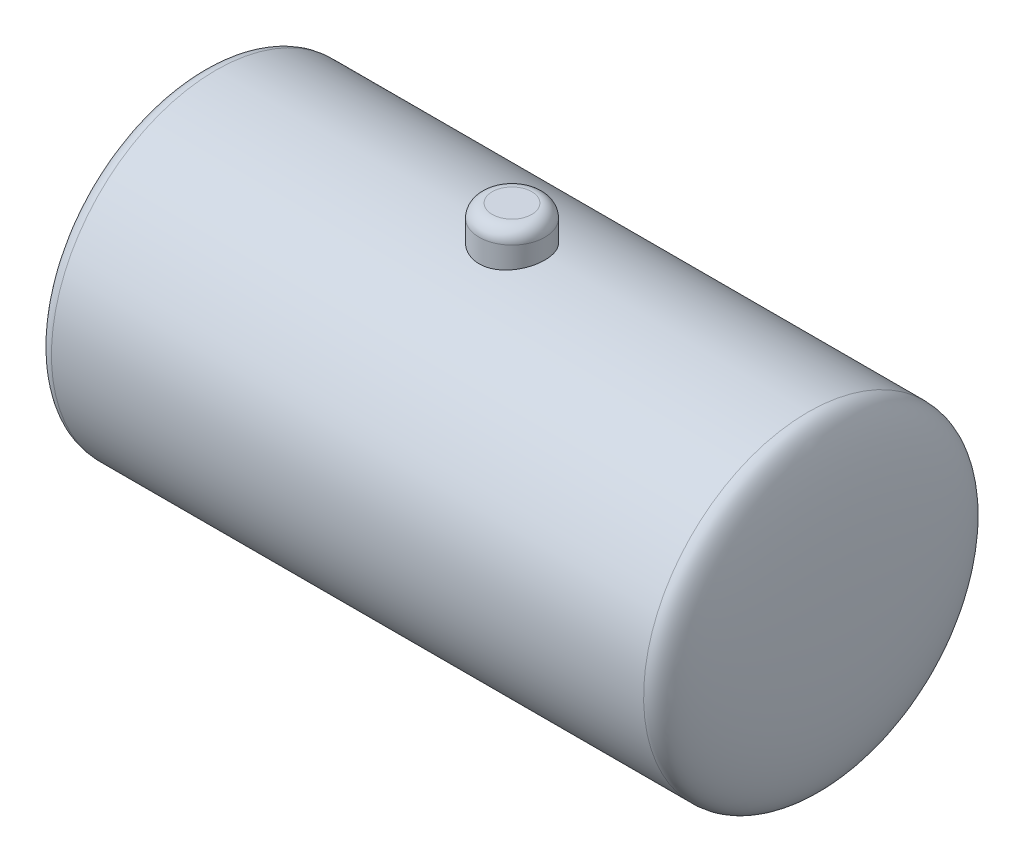
ISO-10303-21;
HEADER;
FILE_DESCRIPTION(('STEP AP214'),'2;1');
FILE_NAME('part.step','',(''),(''),'','','');
FILE_SCHEMA(('AUTOMOTIVE_DESIGN { 1 0 10303 214 1 1 1 1 }'));
ENDSEC;
DATA;
#1=APPLICATION_CONTEXT('core data for automotive mechanical design processes');
#2=APPLICATION_PROTOCOL_DEFINITION('international standard','automotive_design',2000,#1);
#3=PRODUCT_CONTEXT('',#1,'mechanical');
#4=PRODUCT('Part','Part','',(#3));
#5=PRODUCT_RELATED_PRODUCT_CATEGORY('part','',(#4));
#6=PRODUCT_DEFINITION_FORMATION('','',#4);
#7=PRODUCT_DEFINITION_CONTEXT('part definition',#1,'design');
#8=PRODUCT_DEFINITION('design','',#6,#7);
#9=PRODUCT_DEFINITION_SHAPE('','',#8);
#10=(LENGTH_UNIT() NAMED_UNIT(*) SI_UNIT(.MILLI.,.METRE.));
#11=(NAMED_UNIT(*) PLANE_ANGLE_UNIT() SI_UNIT($,.RADIAN.));
#12=(NAMED_UNIT(*) SI_UNIT($,.STERADIAN.) SOLID_ANGLE_UNIT());
#13=UNCERTAINTY_MEASURE_WITH_UNIT(LENGTH_MEASURE(1.E-05),#10,'distance_accuracy_value','');
#14=(GEOMETRIC_REPRESENTATION_CONTEXT(3) GLOBAL_UNCERTAINTY_ASSIGNED_CONTEXT((#13)) GLOBAL_UNIT_ASSIGNED_CONTEXT((#10,
#11,#12)) REPRESENTATION_CONTEXT('',''));
#15=CARTESIAN_POINT('',(0.,0.,0.));
#16=DIRECTION('',(0.,0.,1.));
#17=DIRECTION('',(1.,0.,0.));
#18=AXIS2_PLACEMENT_3D('',#15,#16,#17);
#19=CARTESIAN_POINT('',(45.,0.,0.));
#20=DIRECTION('',(-1.,0.,0.));
#21=DIRECTION('',(0.,0.,1.));
#22=AXIS2_PLACEMENT_3D('',#19,#20,#21);
#23=CYLINDRICAL_SURFACE('',#22,25.);
#24=CARTESIAN_POINT('',(25.,-24.8746859276655,2.5));
#25=CARTESIAN_POINT('',(25.140048910434,-24.8746875699226,2.49999393348378));
#26=CARTESIAN_POINT('',(25.2801904210296,-24.8758814248555,2.48819214745619));
#27=CARTESIAN_POINT('',(25.5565879657338,-24.880527188953,2.4412907869089));
#28=CARTESIAN_POINT('',(25.6928395450937,-24.8839815865305,2.40616553721609));
#29=CARTESIAN_POINT('',(25.9574145480448,-24.8927533261847,2.31365029017232));
#30=CARTESIAN_POINT('',(26.0857427234786,-24.8980695386697,2.25627379073475));
#31=CARTESIAN_POINT('',(26.3309194807294,-24.9099645142955,2.12091066847775));
#32=CARTESIAN_POINT('',(26.4477703362093,-24.9165430266082,2.04292813906481));
#33=CARTESIAN_POINT('',(26.6671281591437,-24.9302481677475,1.86826190499676));
#34=CARTESIAN_POINT('',(26.7695875237595,-24.9373765001317,1.77151854527065));
#35=CARTESIAN_POINT('',(26.9568440225089,-24.951362630893,1.56220428829891));
#36=CARTESIAN_POINT('',(27.0416403485158,-24.9582204168803,1.44963266726642));
#37=CARTESIAN_POINT('',(27.1913281425179,-24.9709095788901,1.21156590412747));
#38=CARTESIAN_POINT('',(27.2561774969842,-24.9767387723662,1.08604415632392));
#39=CARTESIAN_POINT('',(27.3638610828717,-24.9866954218943,0.825824960718775));
#40=CARTESIAN_POINT('',(27.4066958509237,-24.9908229194266,0.691127736670546));
#41=CARTESIAN_POINT('',(27.4689947733831,-24.9968991642756,0.416861956857374));
#42=CARTESIAN_POINT('',(27.4885370818749,-24.9988551960704,0.277311317578954));
#43=CARTESIAN_POINT('',(27.5039381728343,-25.0003928899673,-0.00310185172235723));
#44=CARTESIAN_POINT('',(27.4997975693657,-24.9999746136318,-0.143964347636152));
#45=CARTESIAN_POINT('',(27.4680138183746,-24.9968167827796,-0.422472110161399));
#46=CARTESIAN_POINT('',(27.4404547110903,-24.9940855287928,-0.560127074837447));
#47=CARTESIAN_POINT('',(27.3627471776334,-24.9866182316233,-0.828847948761331));
#48=CARTESIAN_POINT('',(27.3125984580311,-24.9818821623988,-0.95991377239432));
#49=CARTESIAN_POINT('',(27.1910430918639,-24.9709234370979,-1.21200078669896));
#50=CARTESIAN_POINT('',(27.1195992561746,-24.9646981841439,-1.33300392745412));
#51=CARTESIAN_POINT('',(26.9575086916591,-24.9514596129852,-1.56133378293548));
#52=CARTESIAN_POINT('',(26.866861399637,-24.9444462716703,-1.66866009640207));
#53=CARTESIAN_POINT('',(26.6684644262159,-24.9303823366963,-1.86708192955672));
#54=CARTESIAN_POINT('',(26.5606416381461,-24.9233317143257,-1.95810436547586));
#55=CARTESIAN_POINT('',(26.3312078369731,-24.9100184982056,-2.12076883839479));
#56=CARTESIAN_POINT('',(26.2095968038696,-24.9037559055991,-2.19241084728222));
#57=CARTESIAN_POINT('',(25.9559824370005,-24.8927272378537,-2.31428046143307));
#58=CARTESIAN_POINT('',(25.8239769189428,-24.8879614783139,-2.3645035514324));
#59=CARTESIAN_POINT('',(25.5533484884633,-24.8804725467734,-2.44205183909397));
#60=CARTESIAN_POINT('',(25.4147257777814,-24.8777493125442,-2.46937773435758));
#61=CARTESIAN_POINT('',(25.1354395511762,-24.8746645131854,-2.5002619384799));
#62=CARTESIAN_POINT('',(24.9947874493379,-24.8742927886901,-2.50392249161803));
#63=CARTESIAN_POINT('',(24.7148718354428,-24.8759262838693,-2.4876406171784));
#64=CARTESIAN_POINT('',(24.5756083046491,-24.8779314714265,-2.46769850852438));
#65=CARTESIAN_POINT('',(24.3027210443041,-24.88408361056,-2.4048629362688));
#66=CARTESIAN_POINT('',(24.1690860722633,-24.8882260500336,-2.36201781797227));
#67=CARTESIAN_POINT('',(23.9108998706742,-24.8981822759699,-2.25464179918985));
#68=CARTESIAN_POINT('',(23.786348849282,-24.9039961007167,-2.19011040195897));
#69=CARTESIAN_POINT('',(23.5494000649281,-24.9166646088928,-2.04093750355804));
#70=CARTESIAN_POINT('',(23.4370451450844,-24.9235227703668,-1.95622824960173));
#71=CARTESIAN_POINT('',(23.2281123668148,-24.9374958156297,-1.76920133362794));
#72=CARTESIAN_POINT('',(23.1315348991498,-24.9446107057716,-1.66688323562034));
#73=CARTESIAN_POINT('',(22.9565459165048,-24.9583261962325,-1.44709951056618));
#74=CARTESIAN_POINT('',(22.8782011010344,-24.9649248513869,-1.32958063992363));
#75=CARTESIAN_POINT('',(22.742360328734,-24.9768360526658,-1.08299429354283));
#76=CARTESIAN_POINT('',(22.6848640862322,-24.9821486164123,-0.953926976074064));
#77=CARTESIAN_POINT('',(22.5924655808617,-24.9908802603501,-0.688140316082039));
#78=CARTESIAN_POINT('',(22.557523031687,-24.9943027151412,-0.551435094124899));
#79=CARTESIAN_POINT('',(22.5110923260504,-24.9988823653412,-0.274062034959199));
#80=CARTESIAN_POINT('',(22.4996035104149,-25.0000396244141,-0.133394309230545));
#81=CARTESIAN_POINT('',(22.5004156660999,-24.9999584578317,0.147255560189365));
#82=CARTESIAN_POINT('',(22.5126130920916,-24.9987304594167,0.287238018061319));
#83=CARTESIAN_POINT('',(22.5602343641424,-24.9940373394398,0.563154720890906));
#84=CARTESIAN_POINT('',(22.5956582284324,-24.9905722161218,0.699088962670913));
#85=CARTESIAN_POINT('',(22.6886981434823,-24.981793095349,0.963049771919358));
#86=CARTESIAN_POINT('',(22.7463111673354,-24.9764793500812,1.09107741519382));
#87=CARTESIAN_POINT('',(22.8820829222924,-24.9645953104074,1.33566150038699));
#88=CARTESIAN_POINT('',(22.9602415331778,-24.9580250233539,1.4522180094214));
#89=CARTESIAN_POINT('',(23.1352740475594,-24.9443296167264,1.67108181106734));
#90=CARTESIAN_POINT('',(23.232225040612,-24.9372022865175,1.77332731554835));
#91=CARTESIAN_POINT('',(23.4419383788636,-24.9232147692415,1.96014439848285));
#92=CARTESIAN_POINT('',(23.5547045129227,-24.9163546466944,2.04471172961962));
#93=CARTESIAN_POINT('',(23.7931608547998,-24.903659585265,2.19394160106013));
#94=CARTESIAN_POINT('',(23.9188832033101,-24.8978272981327,2.25855296998708));
#95=CARTESIAN_POINT('',(24.1793707281156,-24.8878798690615,2.36566177024692));
#96=CARTESIAN_POINT('',(24.3141255098143,-24.883762791334,2.40818414472464));
#97=CARTESIAN_POINT('',(24.5413693522478,-24.8787501884536,2.45930422083382));
#98=CARTESIAN_POINT('',(24.6324056282661,-24.8772332983924,2.47454428099556));
#99=CARTESIAN_POINT('',(24.8156145576064,-24.8752006294416,2.49489414651278));
#100=CARTESIAN_POINT('',(24.9077872061565,-24.8746848463496,2.50000399439316));
#101=CARTESIAN_POINT('',(25.,-24.8746859276655,2.5));
#102=B_SPLINE_CURVE_WITH_KNOTS('',3,(#24,#25,#26,#27,#28,#29,#30,#31,#32,#33,#34,#35,#36,#37,
#38,#39,#40,#41,#42,#43,#44,#45,#46,#47,#48,#49,#50,#51,#52,#53,#54,#55,#56,#57,#58,#59,#60,#61,
#62,#63,#64,#65,#66,#67,#68,#69,#70,#71,#72,#73,#74,#75,#76,#77,#78,#79,#80,#81,#82,#83,#84,#85,
#86,#87,#88,#89,#90,#91,#92,#93,#94,#95,#96,#97,#98,#99,#100,#101),.UNSPECIFIED.,.T.,.F.,(4,2,2,
2,2,2,2,2,2,2,2,2,2,2,2,2,2,2,2,2,2,2,2,2,2,2,2,2,2,2,2,2,2,2,2,2,2,2,4),(0.,0.419809986091155,
0.840082879554424,1.26010122749368,1.68003620105329,2.10132903824813,2.52264114638132,
2.94483674928229,3.36702206019486,3.78778677246124,4.2085405749558,4.62779079546653,
5.04704646202435,5.46703863666033,5.88704313046321,6.30888562712502,6.73072873568906,
7.15266072794833,7.57457986487581,7.99467490769412,8.41476427417175,8.83397036761317,
9.25318606402618,9.67382974529294,10.0944838430801,10.516653420453,10.9388172129501,
11.360224817359,11.7816205778287,12.2011783367121,12.6207364249164,13.0402372998811,
13.45973572027,13.8809928759497,14.3023511258631,14.7247810267619,15.14673287235,
15.4231506901512,15.6995673475954),.UNSPECIFIED.);
#103=CARTESIAN_POINT('',(25.,-24.8746859276655,2.5));
#104=VERTEX_POINT('',#103);
#105=EDGE_CURVE('E112',#104,#104,#102,.T.);
#106=ORIENTED_EDGE('',*,*,#105,.T.);
#107=EDGE_LOOP('',(#106));
#108=FACE_BOUND('',#107,.T.);
#109=CARTESIAN_POINT('',(-25.,-24.8746859276655,2.5));
#110=CARTESIAN_POINT('',(-24.859951089566,-24.8746875699226,2.49999393348378));
#111=CARTESIAN_POINT('',(-24.7198095789704,-24.8758814248555,2.48819214745619));
#112=CARTESIAN_POINT('',(-24.4434120342662,-24.880527188953,2.4412907869089));
#113=CARTESIAN_POINT('',(-24.3071604549063,-24.8839815865305,2.40616553721609));
#114=CARTESIAN_POINT('',(-24.0425854519552,-24.8927533261847,2.31365029017231));
#115=CARTESIAN_POINT('',(-23.9142572765214,-24.8980695386697,2.25627379073475));
#116=CARTESIAN_POINT('',(-23.6690805192706,-24.9099645142955,2.12091066847775));
#117=CARTESIAN_POINT('',(-23.5522296637907,-24.9165430266082,2.04292813906481));
#118=CARTESIAN_POINT('',(-23.3328718408563,-24.9302481677475,1.86826190499676));
#119=CARTESIAN_POINT('',(-23.2304124762406,-24.9373765001317,1.77151854527065));
#120=CARTESIAN_POINT('',(-23.0431559774911,-24.951362630893,1.56220428829891));
#121=CARTESIAN_POINT('',(-22.9583596514842,-24.9582204168803,1.44963266726642));
#122=CARTESIAN_POINT('',(-22.8086718574821,-24.9709095788901,1.21156590412747));
#123=CARTESIAN_POINT('',(-22.7438225030158,-24.9767387723662,1.08604415632392));
#124=CARTESIAN_POINT('',(-22.6361389171283,-24.9866954218943,0.825824960718775));
#125=CARTESIAN_POINT('',(-22.5933041490763,-24.9908229194266,0.691127736670546));
#126=CARTESIAN_POINT('',(-22.5310052266169,-24.9968991642756,0.416861956857374));
#127=CARTESIAN_POINT('',(-22.5114629181251,-24.9988551960704,0.277311317578954));
#128=CARTESIAN_POINT('',(-22.4960618271657,-25.0003928899673,-0.00310185172235731));
#129=CARTESIAN_POINT('',(-22.5002024306343,-24.9999746136318,-0.143964347636153));
#130=CARTESIAN_POINT('',(-22.5319861816254,-24.9968167827796,-0.422472110161399));
#131=CARTESIAN_POINT('',(-22.5595452889097,-24.9940855287928,-0.560127074837446));
#132=CARTESIAN_POINT('',(-22.6372528223666,-24.9866182316233,-0.828847948761331));
#133=CARTESIAN_POINT('',(-22.6874015419689,-24.9818821623988,-0.95991377239432));
#134=CARTESIAN_POINT('',(-22.8089569081361,-24.9709234370979,-1.21200078669896));
#135=CARTESIAN_POINT('',(-22.8804007438254,-24.9646981841439,-1.33300392745412));
#136=CARTESIAN_POINT('',(-23.0424913083409,-24.9514596129852,-1.56133378293548));
#137=CARTESIAN_POINT('',(-23.133138600363,-24.9444462716703,-1.66866009640207));
#138=CARTESIAN_POINT('',(-23.3315355737841,-24.9303823366963,-1.86708192955672));
#139=CARTESIAN_POINT('',(-23.4393583618539,-24.9233317143257,-1.95810436547585));
#140=CARTESIAN_POINT('',(-23.6687921630269,-24.9100184982056,-2.12076883839479));
#141=CARTESIAN_POINT('',(-23.7904031961304,-24.9037559055991,-2.19241084728222));
#142=CARTESIAN_POINT('',(-24.0440175629995,-24.8927272378537,-2.31428046143307));
#143=CARTESIAN_POINT('',(-24.1760230810572,-24.8879614783139,-2.3645035514324));
#144=CARTESIAN_POINT('',(-24.4466515115367,-24.8804725467734,-2.44205183909397));
#145=CARTESIAN_POINT('',(-24.5852742222186,-24.8777493125442,-2.46937773435758));
#146=CARTESIAN_POINT('',(-24.8645604488238,-24.8746645131854,-2.5002619384799));
#147=CARTESIAN_POINT('',(-25.0052125506621,-24.8742927886901,-2.50392249161803));
#148=CARTESIAN_POINT('',(-25.2851281645572,-24.8759262838693,-2.4876406171784));
#149=CARTESIAN_POINT('',(-25.4243916953509,-24.8779314714265,-2.46769850852438));
#150=CARTESIAN_POINT('',(-25.6972789556959,-24.88408361056,-2.4048629362688));
#151=CARTESIAN_POINT('',(-25.8309139277367,-24.8882260500336,-2.36201781797227));
#152=CARTESIAN_POINT('',(-26.0891001293258,-24.8981822759699,-2.25464179918985));
#153=CARTESIAN_POINT('',(-26.213651150718,-24.9039961007167,-2.19011040195897));
#154=CARTESIAN_POINT('',(-26.4505999350719,-24.9166646088928,-2.04093750355804));
#155=CARTESIAN_POINT('',(-26.5629548549156,-24.9235227703668,-1.95622824960173));
#156=CARTESIAN_POINT('',(-26.7718876331852,-24.9374958156297,-1.76920133362793));
#157=CARTESIAN_POINT('',(-26.8684651008502,-24.9446107057716,-1.66688323562034));
#158=CARTESIAN_POINT('',(-27.0434540834952,-24.9583261962325,-1.44709951056618));
#159=CARTESIAN_POINT('',(-27.1217988989656,-24.9649248513869,-1.32958063992363));
#160=CARTESIAN_POINT('',(-27.257639671266,-24.9768360526658,-1.08299429354283));
#161=CARTESIAN_POINT('',(-27.3151359137678,-24.9821486164123,-0.953926976074064));
#162=CARTESIAN_POINT('',(-27.4075344191383,-24.9908802603501,-0.688140316082038));
#163=CARTESIAN_POINT('',(-27.442476968313,-24.9943027151412,-0.551435094124899));
#164=CARTESIAN_POINT('',(-27.4889076739496,-24.9988823653412,-0.274062034959199));
#165=CARTESIAN_POINT('',(-27.5003964895851,-25.0000396244141,-0.133394309230545));
#166=CARTESIAN_POINT('',(-27.4995843339002,-24.9999584578317,0.147255560189365));
#167=CARTESIAN_POINT('',(-27.4873869079084,-24.9987304594167,0.287238018061319));
#168=CARTESIAN_POINT('',(-27.4397656358576,-24.9940373394398,0.563154720890906));
#169=CARTESIAN_POINT('',(-27.4043417715676,-24.9905722161218,0.699088962670912));
#170=CARTESIAN_POINT('',(-27.3113018565177,-24.981793095349,0.963049771919356));
#171=CARTESIAN_POINT('',(-27.2536888326646,-24.9764793500812,1.09107741519382));
#172=CARTESIAN_POINT('',(-27.1179170777076,-24.9645953104074,1.33566150038699));
#173=CARTESIAN_POINT('',(-27.0397584668222,-24.9580250233539,1.4522180094214));
#174=CARTESIAN_POINT('',(-26.8647259524406,-24.9443296167264,1.67108181106734));
#175=CARTESIAN_POINT('',(-26.767774959388,-24.9372022865175,1.77332731554835));
#176=CARTESIAN_POINT('',(-26.5580616211364,-24.9232147692415,1.96014439848285));
#177=CARTESIAN_POINT('',(-26.4452954870773,-24.9163546466944,2.04471172961962));
#178=CARTESIAN_POINT('',(-26.2068391452002,-24.903659585265,2.19394160106013));
#179=CARTESIAN_POINT('',(-26.0811167966899,-24.8978272981327,2.25855296998708));
#180=CARTESIAN_POINT('',(-25.8206292718844,-24.8878798690615,2.36566177024692));
#181=CARTESIAN_POINT('',(-25.6858744901857,-24.883762791334,2.40818414472464));
#182=CARTESIAN_POINT('',(-25.4586306477522,-24.8787501884536,2.45930422083382));
#183=CARTESIAN_POINT('',(-25.3675943717339,-24.8772332983924,2.47454428099556));
#184=CARTESIAN_POINT('',(-25.1843854423936,-24.8752006294416,2.49489414651278));
#185=CARTESIAN_POINT('',(-25.0922127938435,-24.8746848463496,2.50000399439316));
#186=CARTESIAN_POINT('',(-25.,-24.8746859276655,2.5));
#187=B_SPLINE_CURVE_WITH_KNOTS('',3,(#109,#110,#111,#112,#113,#114,#115,#116,#117,#118,#119,
#120,#121,#122,#123,#124,#125,#126,#127,#128,#129,#130,#131,#132,#133,#134,#135,#136,#137,#138,
#139,#140,#141,#142,#143,#144,#145,#146,#147,#148,#149,#150,#151,#152,#153,#154,#155,#156,#157,
#158,#159,#160,#161,#162,#163,#164,#165,#166,#167,#168,#169,#170,#171,#172,#173,#174,#175,#176,
#177,#178,#179,#180,#181,#182,#183,#184,#185,#186),.UNSPECIFIED.,.T.,.F.,(4,2,2,2,2,2,2,2,2,2,2,
2,2,2,2,2,2,2,2,2,2,2,2,2,2,2,2,2,2,2,2,2,2,2,2,2,2,2,4),(0.,0.419809986091155,
0.840082879554424,1.26010122749368,1.68003620105329,2.10132903824813,2.52264114638132,
2.94483674928229,3.36702206019486,3.78778677246124,4.2085405749558,4.62779079546653,
5.04704646202435,5.46703863666033,5.88704313046321,6.30888562712502,6.73072873568907,
7.15266072794833,7.57457986487581,7.99467490769413,8.41476427417175,8.83397036761317,
9.25318606402618,9.67382974529294,10.0944838430801,10.5166534204529,10.9388172129501,
11.360224817359,11.7816205778287,12.2011783367121,12.6207364249164,13.0402372998811,
13.45973572027,13.8809928759497,14.3023511258631,14.7247810267619,15.14673287235,
15.4231506901512,15.6995673475954),.UNSPECIFIED.);
#188=CARTESIAN_POINT('',(-25.,-24.8746859276655,2.5));
#189=VERTEX_POINT('',#188);
#190=EDGE_CURVE('E65',#189,#189,#187,.T.);
#191=ORIENTED_EDGE('',*,*,#190,.T.);
#192=EDGE_LOOP('',(#191));
#193=FACE_BOUND('',#192,.T.);
#194=CARTESIAN_POINT('',(45.,0.,0.));
#195=DIRECTION('',(1.,0.,0.));
#196=DIRECTION('',(0.,0.,-1.));
#197=AXIS2_PLACEMENT_3D('',#194,#195,#196);
#198=CIRCLE('',#197,25.);
#199=CARTESIAN_POINT('',(45.,0.,-25.));
#200=VERTEX_POINT('',#199);
#201=EDGE_CURVE('E56',#200,#200,#198,.T.);
#202=ORIENTED_EDGE('',*,*,#201,.F.);
#203=EDGE_LOOP('',(#202));
#204=FACE_BOUND('',#203,.T.);
#205=CARTESIAN_POINT('',(-45.,0.,0.));
#206=DIRECTION('',(1.,0.,0.));
#207=DIRECTION('',(0.,1.,0.));
#208=AXIS2_PLACEMENT_3D('',#205,#206,#207);
#209=CIRCLE('',#208,25.);
#210=CARTESIAN_POINT('',(-45.,25.,0.));
#211=VERTEX_POINT('',#210);
#212=EDGE_CURVE('E59',#211,#211,#209,.T.);
#213=ORIENTED_EDGE('',*,*,#212,.T.);
#214=EDGE_LOOP('',(#213));
#215=FACE_BOUND('',#214,.T.);
#216=CARTESIAN_POINT('',(0.,24.4948974278318,-5.));
#217=CARTESIAN_POINT('',(-0.138956228432175,24.4948959140652,-5.00000277932283));
#218=CARTESIAN_POINT('',(-0.277877759427022,24.4960820445244,-4.99420583952395));
#219=CARTESIAN_POINT('',(-0.554760910782418,24.5007881327193,-4.97106951247274));
#220=CARTESIAN_POINT('',(-0.692722344806998,24.5043085313918,-4.95372794446977));
#221=CARTESIAN_POINT('',(-0.966714129081263,24.5135833999899,-4.90762442723258));
#222=CARTESIAN_POINT('',(-1.10274345492746,24.5193390123237,-4.8788566379347));
#223=CARTESIAN_POINT('',(-1.37188892080659,24.5329168521693,-4.8101161975473));
#224=CARTESIAN_POINT('',(-1.50500396886891,24.5407398404405,-4.77013942141009));
#225=CARTESIAN_POINT('',(-1.76715614052518,24.5582115919251,-4.679356239882));
#226=CARTESIAN_POINT('',(-1.89619864039771,24.5678578195523,-4.62856486213672));
#227=CARTESIAN_POINT('',(-2.14956304127907,24.5887102826167,-4.51647818958425));
#228=CARTESIAN_POINT('',(-2.27388318016664,24.5999170932378,-4.45517901998884));
#229=CARTESIAN_POINT('',(-2.5168633390302,24.6235656382957,-4.32256259117468));
#230=CARTESIAN_POINT('',(-2.63552584385088,24.6360068230559,-4.25124978528394));
#231=CARTESIAN_POINT('',(-2.86650780331227,24.6617859698465,-4.09905714012307));
#232=CARTESIAN_POINT('',(-2.97882486626249,24.6751242659164,-4.0181737286281));
#233=CARTESIAN_POINT('',(-3.19767262714864,24.7024933301151,-3.84635941756609));
#234=CARTESIAN_POINT('',(-3.30411496524357,24.7165306060046,-3.7553169869603));
#235=CARTESIAN_POINT('',(-3.50901761116524,24.7447550172108,-3.56460271884441));
#236=CARTESIAN_POINT('',(-3.60747494602792,24.7589422061409,-3.46492769556318));
#237=CARTESIAN_POINT('',(-3.79566965444345,24.7870621737417,-3.25767968751707));
#238=CARTESIAN_POINT('',(-3.88540959714398,24.80099502638,-3.15010904621878));
#239=CARTESIAN_POINT('',(-4.05561553244616,24.8282290266689,-2.92772937682517));
#240=CARTESIAN_POINT('',(-4.13607809534406,24.8415299396397,-2.81291769594009));
#241=CARTESIAN_POINT('',(-4.28775992933208,24.867232331661,-2.57586269555549));
#242=CARTESIAN_POINT('',(-4.35889618572743,24.8796253494226,-2.45356521066842));
#243=CARTESIAN_POINT('',(-4.49061561976306,24.9030409030999,-2.20327286170085));
#244=CARTESIAN_POINT('',(-4.55119483884866,24.9140629244939,-2.0752758829805));
#245=CARTESIAN_POINT('',(-4.71629352646733,24.9445697433125,-1.68417147036292));
#246=CARTESIAN_POINT('',(-4.80435684781525,24.9615274484324,-1.41366454176391));
#247=CARTESIAN_POINT('',(-4.9325572950363,24.9865205281948,-0.865044260538021));
#248=CARTESIAN_POINT('',(-4.97331059941089,24.9946705178815,-0.58707808925146));
#249=CARTESIAN_POINT('',(-5.00774904818614,25.001544855821,-0.0281034479881242));
#250=CARTESIAN_POINT('',(-5.00143872813593,25.0002701123409,0.25290472622284));
#251=CARTESIAN_POINT('',(-4.94237059736807,24.9885220591615,0.805712786453444));
#252=CARTESIAN_POINT('',(-4.89027551576091,24.9781800029126,1.07758681729645));
#253=CARTESIAN_POINT('',(-4.74217443608932,24.9496087733464,1.60865738706756));
#254=CARTESIAN_POINT('',(-4.64616668110936,24.93137928446,1.86785341829837));
#255=CARTESIAN_POINT('',(-4.41234990787511,24.8888648238832,2.36809751770485));
#256=CARTESIAN_POINT('',(-4.2742812735962,24.8645424148967,2.60902092474939));
#257=CARTESIAN_POINT('',(-3.96045458469301,24.812523467553,3.06452517521266));
#258=CARTESIAN_POINT('',(-3.7846921932812,24.7848265411053,3.27910298301492));
#259=CARTESIAN_POINT('',(-3.39683189746096,24.7285482199077,3.67975717013202));
#260=CARTESIAN_POINT('',(-3.18415406849625,24.6999598233212,3.86527158685728));
#261=CARTESIAN_POINT('',(-2.730417785602,24.6455785794926,4.19809246189484));
#262=CARTESIAN_POINT('',(-2.48935879501062,24.6197857851305,4.3453981975471));
#263=CARTESIAN_POINT('',(-1.98489584146561,24.5739023737433,4.5978140751034));
#264=CARTESIAN_POINT('',(-1.72144516194926,24.5538240781191,4.7028332392629));
#265=CARTESIAN_POINT('',(-1.1801433812325,24.521823816122,4.86695170776361));
#266=CARTESIAN_POINT('',(-0.902294161888907,24.5099007867518,4.9260569968798));
#267=CARTESIAN_POINT('',(-0.345175710012984,24.4957739630664,4.99583003057767));
#268=CARTESIAN_POINT('',(-0.0660121283522963,24.493407351626,5.00730929570102));
#269=CARTESIAN_POINT('',(0.490241115924468,24.4982242831088,4.98368814034094));
#270=CARTESIAN_POINT('',(0.767330895246229,24.5054072844901,4.94859036116145));
#271=CARTESIAN_POINT('',(1.30884320179901,24.5283616252697,4.83351104478034));
#272=CARTESIAN_POINT('',(1.57336171646508,24.5440499515026,4.75396312055877));
#273=CARTESIAN_POINT('',(2.08531639385734,24.5821744668054,4.55270516017897));
#274=CARTESIAN_POINT('',(2.33275114737079,24.6046112117261,4.43099165081897));
#275=CARTESIAN_POINT('',(2.80706555462128,24.6540703007231,4.1470207729206));
#276=CARTESIAN_POINT('',(3.03363524979288,24.6811486029996,3.98425562210339));
#277=CARTESIAN_POINT('',(3.45654154171395,24.7366861815763,3.62347762885003));
#278=CARTESIAN_POINT('',(3.65287502295147,24.7651455997886,3.4254611586761));
#279=CARTESIAN_POINT('',(4.01281286527109,24.8207673304219,2.99616224784609));
#280=CARTESIAN_POINT('',(4.17586853389528,24.8479030243562,2.76441580370579));
#281=CARTESIAN_POINT('',(4.46072914686357,24.8973562425148,2.27633617425512));
#282=CARTESIAN_POINT('',(4.5825358235458,24.9196739690654,2.02000402205358));
#283=CARTESIAN_POINT('',(4.78064532630623,24.9568652187611,1.49152568807435));
#284=CARTESIAN_POINT('',(4.85720619263723,24.9717808767,1.21947909079514));
#285=CARTESIAN_POINT('',(4.96345263724712,24.9926598775445,0.665901555502931));
#286=CARTESIAN_POINT('',(4.99314386129754,24.9986242986841,0.384371763979329));
#287=CARTESIAN_POINT('',(5.00180038909471,25.0003623098663,-0.0359308696076334));
#288=CARTESIAN_POINT('',(4.99887564200989,24.9997743264358,-0.174547706902776));
#289=CARTESIAN_POINT('',(4.98153854083119,24.9963121932555,-0.451018250343529));
#290=CARTESIAN_POINT('',(4.96713054343888,24.9934389105404,-0.588872225946722));
#291=CARTESIAN_POINT('',(4.92692863683965,24.9854807163608,-0.8628829006169));
#292=CARTESIAN_POINT('',(4.90113078415607,24.9803950389143,-0.999038995028385));
#293=CARTESIAN_POINT('',(4.83836516551053,24.9681563049873,-1.2686070645044));
#294=CARTESIAN_POINT('',(4.8014013926633,24.9610039876105,-1.40202000237942));
#295=CARTESIAN_POINT('',(4.71666615796401,24.9448434641995,-1.66496388536662));
#296=CARTESIAN_POINT('',(4.66891578522037,24.9358388825964,-1.79450185423182));
#297=CARTESIAN_POINT('',(4.56294207731695,24.9162142305196,-2.04903823379663));
#298=CARTESIAN_POINT('',(4.50472245389937,24.9055947327996,-2.17403823455953));
#299=CARTESIAN_POINT('',(4.37819338299605,24.8830203693368,-2.4187611555957));
#300=CARTESIAN_POINT('',(4.3098797873512,24.8710649550885,-2.53848187993982));
#301=CARTESIAN_POINT('',(4.16368560734574,24.8461484673941,-2.77176194719751));
#302=CARTESIAN_POINT('',(4.08580831288378,24.8331877403362,-2.88532338962303));
#303=CARTESIAN_POINT('',(3.91963723250234,24.8063847462598,-3.107409439357));
#304=CARTESIAN_POINT('',(3.83119274567195,24.7925314606031,-3.21581998719232));
#305=CARTESIAN_POINT('',(3.64558859737661,24.7645291791264,-3.42479299282091));
#306=CARTESIAN_POINT('',(3.5484320083593,24.7503802888953,-3.52535819417319));
#307=CARTESIAN_POINT('',(3.34597252660902,24.7221657734697,-3.71806545178663));
#308=CARTESIAN_POINT('',(3.24066479635567,24.7081002031371,-3.81020243422066));
#309=CARTESIAN_POINT('',(3.02270103815523,24.6804587105912,-3.98532502872243));
#310=CARTESIAN_POINT('',(2.91004772292782,24.6668826104611,-4.06831398902585));
#311=CARTESIAN_POINT('',(2.6768148430827,24.6404498236186,-4.22547700693866));
#312=CARTESIAN_POINT('',(2.55616077080287,24.6276028717508,-4.29954219421514));
#313=CARTESIAN_POINT('',(2.30895553115726,24.6031736469171,-4.43719880973621));
#314=CARTESIAN_POINT('',(2.18240655122683,24.5915909100867,-4.50079408397347));
#315=CARTESIAN_POINT('',(1.92432888446366,24.5700331062172,-4.61703044134767));
#316=CARTESIAN_POINT('',(1.79280329372797,24.5600570592754,-4.66967820699909));
#317=CARTESIAN_POINT('',(1.52568600190167,24.5420037041339,-4.76364722951765));
#318=CARTESIAN_POINT('',(1.39009509313648,24.5339260286217,-4.80497067776392));
#319=CARTESIAN_POINT('',(1.04878231160884,24.516494143671,-4.89330917087387));
#320=CARTESIAN_POINT('',(0.841122048542001,24.5084401426211,-4.93326336835889));
#321=CARTESIAN_POINT('',(0.422281082826919,24.4976430260943,-4.98660621384694));
#322=CARTESIAN_POINT('',(0.211100501797822,24.4948997275263,-4.99999577768877));
#323=CARTESIAN_POINT('',(0.,24.4948974278318,-5.));
#324=B_SPLINE_CURVE_WITH_KNOTS('',3,(#216,#217,#218,#219,#220,#221,#222,#223,#224,#225,#226,
#227,#228,#229,#230,#231,#232,#233,#234,#235,#236,#237,#238,#239,#240,#241,#242,#243,#244,#245,
#246,#247,#248,#249,#250,#251,#252,#253,#254,#255,#256,#257,#258,#259,#260,#261,#262,#263,#264,
#265,#266,#267,#268,#269,#270,#271,#272,#273,#274,#275,#276,#277,#278,#279,#280,#281,#282,#283,
#284,#285,#286,#287,#288,#289,#290,#291,#292,#293,#294,#295,#296,#297,#298,#299,#300,#301,#302,
#303,#304,#305,#306,#307,#308,#309,#310,#311,#312,#313,#314,#315,#316,#317,#318,#319,#320,#321,
#322,#323),.UNSPECIFIED.,.T.,.F.,(4,2,2,2,2,2,2,2,2,2,2,2,2,2,2,2,2,2,2,2,2,2,2,2,2,2,2,2,2,2,2,
2,2,2,2,2,2,2,2,2,2,2,2,2,2,2,2,2,2,2,2,2,2,4),(0.,0.416683123532558,0.833444979779736,
1.25042012213458,1.66754891843381,2.08410182437339,2.50080866752238,2.91733077366025,
3.33400883985332,3.75582155231457,4.17779059926178,4.59963490581337,5.02163466502476,
5.44716701587087,5.87285858614629,6.72323197660176,7.56240100842779,8.40148917008619,
9.22862804595065,10.0558000179613,10.8881847753889,11.7206653527771,12.5676559023979,
13.4146624704098,14.2634817229126,15.112190315075,15.9463764545252,16.780515290738,
17.6066556534829,18.4328640820369,19.269841553043,20.1069052078274,20.9568186509895,
21.8066963958222,22.6516792432494,23.4965602988983,23.9121012971265,24.3274847156826,
24.7430120641575,25.158390988859,25.5729647204247,25.9873917587991,26.4019895837877,
26.8164451851411,27.2377409358741,27.6588886906077,28.0802883323103,28.5015332232677,
28.9274855291216,29.3532810158644,29.7788158230356,30.2042682263315,30.8373096537297,
31.4703292560956),.UNSPECIFIED.);
#325=CARTESIAN_POINT('',(0.,24.4948974278318,-5.));
#326=VERTEX_POINT('',#325);
#327=EDGE_CURVE('E58',#326,#326,#324,.T.);
#328=ORIENTED_EDGE('',*,*,#327,.F.);
#329=EDGE_LOOP('',(#328));
#330=FACE_BOUND('',#329,.T.);
#331=ADVANCED_FACE('F34',(#108,#193,#204,#215,#330),#23,.T.);
#332=CARTESIAN_POINT('',(-45.,25.,0.));
#333=CARTESIAN_POINT('',(-50.,25.,0.));
#334=CARTESIAN_POINT('',(-50.,0.,0.));
#335=B_SPLINE_CURVE_WITH_KNOTS('',2,(#332,#333,#334),.UNSPECIFIED.,.F.,.F.,(3,3),(0.,1.),.UNSPECIFIED.);
#336=CARTESIAN_POINT('',(-45.,0.,0.));
#337=DIRECTION('',(1.,0.,0.));
#338=AXIS1_PLACEMENT('',#336,#337);
#339=SURFACE_OF_REVOLUTION('',#335,#338);
#340=CARTESIAN_POINT('',(-50.,0.,0.));
#341=VERTEX_POINT('',#340);
#342=VERTEX_LOOP('',#341);
#343=FACE_BOUND('',#342,.T.);
#344=ORIENTED_EDGE('',*,*,#212,.F.);
#345=EDGE_LOOP('',(#344));
#346=FACE_BOUND('',#345,.T.);
#347=ADVANCED_FACE('F52',(#343,#346),#339,.F.);
#348=CARTESIAN_POINT('',(45.,25.,0.));
#349=CARTESIAN_POINT('',(50.,25.,0.));
#350=CARTESIAN_POINT('',(50.,0.,0.));
#351=B_SPLINE_CURVE_WITH_KNOTS('',2,(#348,#349,#350),.UNSPECIFIED.,.F.,.F.,(3,3),(0.,1.),.UNSPECIFIED.);
#352=CARTESIAN_POINT('',(45.,0.,0.));
#353=DIRECTION('',(-1.,0.,0.));
#354=AXIS1_PLACEMENT('',#352,#353);
#355=SURFACE_OF_REVOLUTION('',#351,#354);
#356=CARTESIAN_POINT('',(50.,0.,0.));
#357=VERTEX_POINT('',#356);
#358=VERTEX_LOOP('',#357);
#359=FACE_BOUND('',#358,.T.);
#360=ORIENTED_EDGE('',*,*,#201,.T.);
#361=EDGE_LOOP('',(#360));
#362=FACE_BOUND('',#361,.T.);
#363=ADVANCED_FACE('F48',(#359,#362),#355,.F.);
#364=CARTESIAN_POINT('',(0.,30.,0.));
#365=DIRECTION('',(0.,-1.,0.));
#366=DIRECTION('',(0.,0.,-1.));
#367=AXIS2_PLACEMENT_3D('',#364,#365,#366);
#368=CYLINDRICAL_SURFACE('',#367,5.);
#369=CARTESIAN_POINT('',(0.,28.,0.));
#370=DIRECTION('',(0.,1.,0.));
#371=DIRECTION('',(0.,0.,1.));
#372=AXIS2_PLACEMENT_3D('',#369,#370,#371);
#373=CIRCLE('',#372,5.);
#374=CARTESIAN_POINT('',(0.,28.,5.));
#375=VERTEX_POINT('',#374);
#376=EDGE_CURVE('E120',#375,#375,#373,.F.);
#377=ORIENTED_EDGE('',*,*,#376,.T.);
#378=EDGE_LOOP('',(#377));
#379=FACE_BOUND('',#378,.T.);
#380=ORIENTED_EDGE('',*,*,#327,.T.);
#381=EDGE_LOOP('',(#380));
#382=FACE_BOUND('',#381,.T.);
#383=ADVANCED_FACE('F51',(#379,#382),#368,.T.);
#384=CARTESIAN_POINT('',(0.,30.,0.));
#385=DIRECTION('',(0.,1.,0.));
#386=DIRECTION('',(0.,0.,1.));
#387=AXIS2_PLACEMENT_3D('',#384,#385,#386);
#388=PLANE('',#387);
#389=CARTESIAN_POINT('',(0.,30.,0.));
#390=DIRECTION('',(0.,1.,0.));
#391=DIRECTION('',(0.,0.,1.));
#392=AXIS2_PLACEMENT_3D('',#389,#390,#391);
#393=CIRCLE('',#392,3.);
#394=CARTESIAN_POINT('',(0.,30.,3.));
#395=VERTEX_POINT('',#394);
#396=EDGE_CURVE('E62',#395,#395,#393,.T.);
#397=ORIENTED_EDGE('',*,*,#396,.T.);
#398=EDGE_LOOP('',(#397));
#399=FACE_BOUND('',#398,.T.);
#400=ADVANCED_FACE('F80',(#399),#388,.T.);
#401=CARTESIAN_POINT('',(0.,28.,0.));
#402=DIRECTION('',(0.,1.,0.));
#403=DIRECTION('',(0.,0.,1.));
#404=AXIS2_PLACEMENT_3D('',#401,#402,#403);
#405=TOROIDAL_SURFACE('',#404,3.,2.);
#406=ORIENTED_EDGE('',*,*,#376,.F.);
#407=EDGE_LOOP('',(#406));
#408=FACE_BOUND('',#407,.T.);
#409=ORIENTED_EDGE('',*,*,#396,.F.);
#410=EDGE_LOOP('',(#409));
#411=FACE_BOUND('',#410,.T.);
#412=ADVANCED_FACE('F130',(#408,#411),#405,.T.);
#413=CARTESIAN_POINT('',(-25.,-30.,0.));
#414=DIRECTION('',(0.,1.,0.));
#415=DIRECTION('',(0.,0.,1.));
#416=AXIS2_PLACEMENT_3D('',#413,#414,#415);
#417=CYLINDRICAL_SURFACE('',#416,2.5);
#418=CARTESIAN_POINT('',(-25.,-29.,0.));
#419=DIRECTION('',(0.,1.,0.));
#420=DIRECTION('',(0.,0.,1.));
#421=AXIS2_PLACEMENT_3D('',#418,#419,#420);
#422=CIRCLE('',#421,2.5);
#423=CARTESIAN_POINT('',(-25.,-29.,2.5));
#424=VERTEX_POINT('',#423);
#425=EDGE_CURVE('E42',#424,#424,#422,.T.);
#426=ORIENTED_EDGE('',*,*,#425,.T.);
#427=EDGE_LOOP('',(#426));
#428=FACE_BOUND('',#427,.T.);
#429=ORIENTED_EDGE('',*,*,#190,.F.);
#430=EDGE_LOOP('',(#429));
#431=FACE_BOUND('',#430,.T.);
#432=ADVANCED_FACE('F125',(#428,#431),#417,.T.);
#433=CARTESIAN_POINT('',(-25.,-30.,0.));
#434=DIRECTION('',(0.,1.,0.));
#435=DIRECTION('',(0.,0.,1.));
#436=AXIS2_PLACEMENT_3D('',#433,#434,#435);
#437=PLANE('',#436);
#438=CARTESIAN_POINT('',(-25.,-30.,0.));
#439=DIRECTION('',(0.,1.,0.));
#440=DIRECTION('',(0.,0.,1.));
#441=AXIS2_PLACEMENT_3D('',#438,#439,#440);
#442=CIRCLE('',#441,1.5);
#443=CARTESIAN_POINT('',(-25.,-30.,1.5));
#444=VERTEX_POINT('',#443);
#445=EDGE_CURVE('E11',#444,#444,#442,.F.);
#446=ORIENTED_EDGE('',*,*,#445,.T.);
#447=EDGE_LOOP('',(#446));
#448=FACE_BOUND('',#447,.T.);
#449=ADVANCED_FACE('F129',(#448),#437,.F.);
#450=CARTESIAN_POINT('',(25.,-30.,0.));
#451=DIRECTION('',(0.,1.,0.));
#452=DIRECTION('',(0.,0.,1.));
#453=AXIS2_PLACEMENT_3D('',#450,#451,#452);
#454=CYLINDRICAL_SURFACE('',#453,2.5);
#455=CARTESIAN_POINT('',(25.,-29.,0.));
#456=DIRECTION('',(0.,1.,0.));
#457=DIRECTION('',(0.,0.,1.));
#458=AXIS2_PLACEMENT_3D('',#455,#456,#457);
#459=CIRCLE('',#458,2.5);
#460=CARTESIAN_POINT('',(25.,-29.,2.5));
#461=VERTEX_POINT('',#460);
#462=EDGE_CURVE('E150',#461,#461,#459,.T.);
#463=ORIENTED_EDGE('',*,*,#462,.T.);
#464=EDGE_LOOP('',(#463));
#465=FACE_BOUND('',#464,.T.);
#466=ORIENTED_EDGE('',*,*,#105,.F.);
#467=EDGE_LOOP('',(#466));
#468=FACE_BOUND('',#467,.T.);
#469=ADVANCED_FACE('F133',(#465,#468),#454,.T.);
#470=CARTESIAN_POINT('',(25.,-30.,0.));
#471=DIRECTION('',(0.,1.,0.));
#472=DIRECTION('',(0.,0.,1.));
#473=AXIS2_PLACEMENT_3D('',#470,#471,#472);
#474=PLANE('',#473);
#475=CARTESIAN_POINT('',(25.,-30.,0.));
#476=DIRECTION('',(0.,1.,0.));
#477=DIRECTION('',(0.,0.,1.));
#478=AXIS2_PLACEMENT_3D('',#475,#476,#477);
#479=CIRCLE('',#478,1.5);
#480=CARTESIAN_POINT('',(25.,-30.,1.5));
#481=VERTEX_POINT('',#480);
#482=EDGE_CURVE('E149',#481,#481,#479,.F.);
#483=ORIENTED_EDGE('',*,*,#482,.T.);
#484=EDGE_LOOP('',(#483));
#485=FACE_BOUND('',#484,.T.);
#486=ADVANCED_FACE('F138',(#485),#474,.F.);
#487=CARTESIAN_POINT('',(25.,-29.,0.));
#488=DIRECTION('',(0.,1.,0.));
#489=DIRECTION('',(0.,0.,1.));
#490=AXIS2_PLACEMENT_3D('',#487,#488,#489);
#491=CONICAL_SURFACE('',#490,2.5,0.785398163397447);
#492=ORIENTED_EDGE('',*,*,#482,.F.);
#493=EDGE_LOOP('',(#492));
#494=FACE_BOUND('',#493,.T.);
#495=ORIENTED_EDGE('',*,*,#462,.F.);
#496=EDGE_LOOP('',(#495));
#497=FACE_BOUND('',#496,.T.);
#498=ADVANCED_FACE('F141',(#494,#497),#491,.T.);
#499=CARTESIAN_POINT('',(-25.,-29.,0.));
#500=DIRECTION('',(0.,1.,0.));
#501=DIRECTION('',(0.,0.,1.));
#502=AXIS2_PLACEMENT_3D('',#499,#500,#501);
#503=CONICAL_SURFACE('',#502,2.5,0.785398163397447);
#504=ORIENTED_EDGE('',*,*,#445,.F.);
#505=EDGE_LOOP('',(#504));
#506=FACE_BOUND('',#505,.T.);
#507=ORIENTED_EDGE('',*,*,#425,.F.);
#508=EDGE_LOOP('',(#507));
#509=FACE_BOUND('',#508,.T.);
#510=ADVANCED_FACE('F36',(#506,#509),#503,.T.);
#511=CLOSED_SHELL('',(#331,#347,#363,#383,#400,#412,#432,#449,#469,#486,#498,#510));
#512=MANIFOLD_SOLID_BREP('B2',#511);
#513=ADVANCED_BREP_SHAPE_REPRESENTATION('',(#18,#512),#14);
#514=SHAPE_DEFINITION_REPRESENTATION(#9,#513);
ENDSEC;
END-ISO-10303-21;
